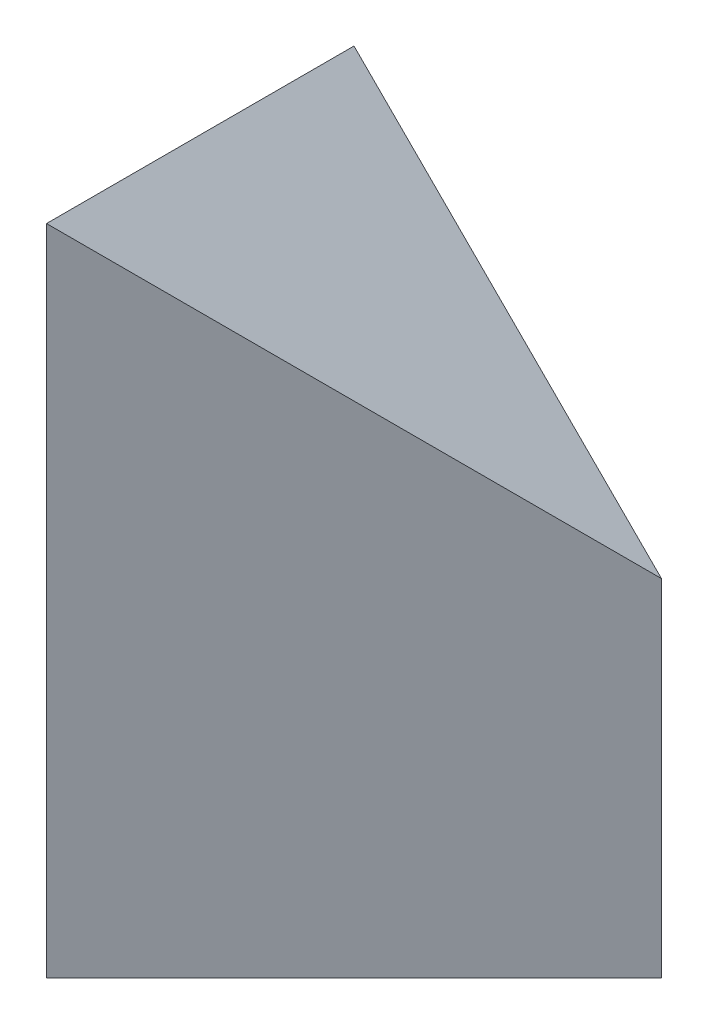
ISO-10303-21;
HEADER;
FILE_DESCRIPTION(('STEP AP214'),'2;1');
FILE_NAME('part.step','',(''),(''),'','','');
FILE_SCHEMA(('AUTOMOTIVE_DESIGN { 1 0 10303 214 1 1 1 1 }'));
ENDSEC;
DATA;
#1=APPLICATION_CONTEXT('core data for automotive mechanical design processes');
#2=APPLICATION_PROTOCOL_DEFINITION('international standard','automotive_design',2000,#1);
#3=PRODUCT_CONTEXT('',#1,'mechanical');
#4=PRODUCT('Part','Part','',(#3));
#5=PRODUCT_RELATED_PRODUCT_CATEGORY('part','',(#4));
#6=PRODUCT_DEFINITION_FORMATION('','',#4);
#7=PRODUCT_DEFINITION_CONTEXT('part definition',#1,'design');
#8=PRODUCT_DEFINITION('design','',#6,#7);
#9=PRODUCT_DEFINITION_SHAPE('','',#8);
#10=(LENGTH_UNIT() NAMED_UNIT(*) SI_UNIT(.MILLI.,.METRE.));
#11=(NAMED_UNIT(*) PLANE_ANGLE_UNIT() SI_UNIT($,.RADIAN.));
#12=(NAMED_UNIT(*) SI_UNIT($,.STERADIAN.) SOLID_ANGLE_UNIT());
#13=UNCERTAINTY_MEASURE_WITH_UNIT(LENGTH_MEASURE(1.E-05),#10,'distance_accuracy_value','');
#14=(GEOMETRIC_REPRESENTATION_CONTEXT(3) GLOBAL_UNCERTAINTY_ASSIGNED_CONTEXT((#13)) GLOBAL_UNIT_ASSIGNED_CONTEXT((#10,
#11,#12)) REPRESENTATION_CONTEXT('',''));
#15=CARTESIAN_POINT('',(0.,0.,0.));
#16=DIRECTION('',(0.,0.,1.));
#17=DIRECTION('',(1.,0.,0.));
#18=AXIS2_PLACEMENT_3D('',#15,#16,#17);
#19=CARTESIAN_POINT('',(0.,107.95,25.4));
#20=DIRECTION('',(-0.707106781186548,0.,-0.707106781186547));
#21=DIRECTION('',(-0.707106781186547,0.,0.707106781186548));
#22=AXIS2_PLACEMENT_3D('',#19,#20,#21);
#23=PLANE('',#22);
#24=DIRECTION('',(0.577350269189626,-0.577350269189624,-0.577350269189627));
#25=VECTOR('',#24,1.);
#26=CARTESIAN_POINT('',(0.,107.95,25.4));
#27=LINE('',#26,#25);
#28=CARTESIAN_POINT('',(0.,107.95,25.4));
#29=VERTEX_POINT('',#28);
#30=CARTESIAN_POINT('',(50.8,57.1500000000002,-25.4));
#31=VERTEX_POINT('',#30);
#32=EDGE_CURVE('E85',#29,#31,#27,.T.);
#33=ORIENTED_EDGE('',*,*,#32,.F.);
#34=DIRECTION('',(0.,-1.,0.));
#35=VECTOR('',#34,1.);
#36=CARTESIAN_POINT('',(0.,107.95,25.4));
#37=LINE('',#36,#35);
#38=CARTESIAN_POINT('',(0.,0.,25.4));
#39=VERTEX_POINT('',#38);
#40=EDGE_CURVE('E76',#29,#39,#37,.T.);
#41=ORIENTED_EDGE('',*,*,#40,.T.);
#42=DIRECTION('',(0.707106781186547,0.,-0.707106781186548));
#43=VECTOR('',#42,1.);
#44=CARTESIAN_POINT('',(0.,0.,25.4));
#45=LINE('',#44,#43);
#46=CARTESIAN_POINT('',(50.8,0.,-25.4));
#47=VERTEX_POINT('',#46);
#48=EDGE_CURVE('E68',#39,#47,#45,.T.);
#49=ORIENTED_EDGE('',*,*,#48,.T.);
#50=DIRECTION('',(0.,-1.,0.));
#51=VECTOR('',#50,1.);
#52=CARTESIAN_POINT('',(50.8,107.95,-25.4));
#53=LINE('',#52,#51);
#54=EDGE_CURVE('E11',#31,#47,#53,.T.);
#55=ORIENTED_EDGE('',*,*,#54,.F.);
#56=EDGE_LOOP('',(#33,#41,#49,#55));
#57=FACE_BOUND('',#56,.T.);
#58=ADVANCED_FACE('F33',(#57),#23,.F.);
#59=CARTESIAN_POINT('',(50.8,107.95,-25.4));
#60=DIRECTION('',(0.,0.,1.));
#61=DIRECTION('',(1.,0.,0.));
#62=AXIS2_PLACEMENT_3D('',#59,#60,#61);
#63=PLANE('',#62);
#64=DIRECTION('',(-0.707106781186549,0.707106781186546,0.));
#65=VECTOR('',#64,1.);
#66=CARTESIAN_POINT('',(25.4000000000001,82.55,-25.4));
#67=LINE('',#66,#65);
#68=CARTESIAN_POINT('',(0.,107.95,-25.4));
#69=VERTEX_POINT('',#68);
#70=EDGE_CURVE('E46',#31,#69,#67,.T.);
#71=ORIENTED_EDGE('',*,*,#70,.F.);
#72=ORIENTED_EDGE('',*,*,#54,.T.);
#73=DIRECTION('',(-1.,0.,0.));
#74=VECTOR('',#73,1.);
#75=CARTESIAN_POINT('',(50.8,0.,-25.4));
#76=LINE('',#75,#74);
#77=CARTESIAN_POINT('',(0.,0.,-25.4));
#78=VERTEX_POINT('',#77);
#79=EDGE_CURVE('E61',#47,#78,#76,.T.);
#80=ORIENTED_EDGE('',*,*,#79,.T.);
#81=DIRECTION('',(0.,-1.,0.));
#82=VECTOR('',#81,1.);
#83=CARTESIAN_POINT('',(0.,107.95,-25.4));
#84=LINE('',#83,#82);
#85=EDGE_CURVE('E40',#69,#78,#84,.T.);
#86=ORIENTED_EDGE('',*,*,#85,.F.);
#87=EDGE_LOOP('',(#71,#72,#80,#86));
#88=FACE_BOUND('',#87,.T.);
#89=ADVANCED_FACE('F62',(#88),#63,.F.);
#90=CARTESIAN_POINT('',(0.,107.95,-25.4));
#91=DIRECTION('',(1.,0.,0.));
#92=DIRECTION('',(0.,0.,-1.));
#93=AXIS2_PLACEMENT_3D('',#90,#91,#92);
#94=PLANE('',#93);
#95=DIRECTION('',(0.,0.,1.));
#96=VECTOR('',#95,1.);
#97=CARTESIAN_POINT('',(0.,0.,-25.4));
#98=LINE('',#97,#96);
#99=EDGE_CURVE('E67',#78,#39,#98,.T.);
#100=ORIENTED_EDGE('',*,*,#99,.T.);
#101=ORIENTED_EDGE('',*,*,#40,.F.);
#102=DIRECTION('',(0.,0.,1.));
#103=VECTOR('',#102,1.);
#104=CARTESIAN_POINT('',(0.,107.95,-25.4));
#105=LINE('',#104,#103);
#106=EDGE_CURVE('E75',#69,#29,#105,.T.);
#107=ORIENTED_EDGE('',*,*,#106,.F.);
#108=ORIENTED_EDGE('',*,*,#85,.T.);
#109=EDGE_LOOP('',(#100,#101,#107,#108));
#110=FACE_BOUND('',#109,.T.);
#111=ADVANCED_FACE('F71',(#110),#94,.F.);
#112=CARTESIAN_POINT('',(0.,0.,0.));
#113=DIRECTION('',(0.,1.,0.));
#114=DIRECTION('',(0.,0.,1.));
#115=AXIS2_PLACEMENT_3D('',#112,#113,#114);
#116=PLANE('',#115);
#117=ORIENTED_EDGE('',*,*,#48,.F.);
#118=ORIENTED_EDGE('',*,*,#99,.F.);
#119=ORIENTED_EDGE('',*,*,#79,.F.);
#120=EDGE_LOOP('',(#117,#118,#119));
#121=FACE_BOUND('',#120,.T.);
#122=ADVANCED_FACE('F77',(#121),#116,.F.);
#123=CARTESIAN_POINT('',(0.,107.95,193.838336737256));
#124=DIRECTION('',(0.707106781186546,0.707106781186549,0.));
#125=DIRECTION('',(-0.707106781186549,0.707106781186546,0.));
#126=AXIS2_PLACEMENT_3D('',#123,#124,#125);
#127=PLANE('',#126);
#128=ORIENTED_EDGE('',*,*,#106,.T.);
#129=ORIENTED_EDGE('',*,*,#32,.T.);
#130=ORIENTED_EDGE('',*,*,#70,.T.);
#131=EDGE_LOOP('',(#128,#129,#130));
#132=FACE_BOUND('',#131,.T.);
#133=ADVANCED_FACE('F88',(#132),#127,.T.);
#134=CLOSED_SHELL('',(#58,#89,#111,#122,#133));
#135=MANIFOLD_SOLID_BREP('B2',#134);
#136=ADVANCED_BREP_SHAPE_REPRESENTATION('',(#18,#135),#14);
#137=SHAPE_DEFINITION_REPRESENTATION(#9,#136);
ENDSEC;
END-ISO-10303-21;
